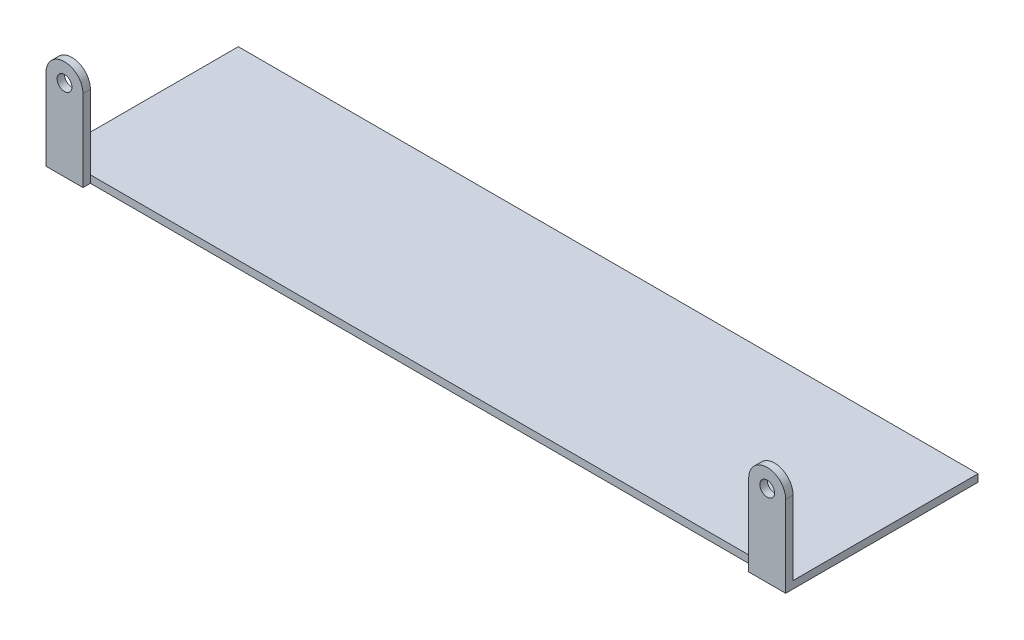
ISO-10303-21;
HEADER;
FILE_DESCRIPTION(('STEP AP214'),'2;1');
FILE_NAME('part.step','',(''),(''),'','','');
FILE_SCHEMA(('AUTOMOTIVE_DESIGN { 1 0 10303 214 1 1 1 1 }'));
ENDSEC;
DATA;
#1=APPLICATION_CONTEXT('core data for automotive mechanical design processes');
#2=APPLICATION_PROTOCOL_DEFINITION('international standard','automotive_design',2000,#1);
#3=PRODUCT_CONTEXT('',#1,'mechanical');
#4=PRODUCT('Part','Part','',(#3));
#5=PRODUCT_RELATED_PRODUCT_CATEGORY('part','',(#4));
#6=PRODUCT_DEFINITION_FORMATION('','',#4);
#7=PRODUCT_DEFINITION_CONTEXT('part definition',#1,'design');
#8=PRODUCT_DEFINITION('design','',#6,#7);
#9=PRODUCT_DEFINITION_SHAPE('','',#8);
#10=(LENGTH_UNIT() NAMED_UNIT(*) SI_UNIT(.MILLI.,.METRE.));
#11=(NAMED_UNIT(*) PLANE_ANGLE_UNIT() SI_UNIT($,.RADIAN.));
#12=(NAMED_UNIT(*) SI_UNIT($,.STERADIAN.) SOLID_ANGLE_UNIT());
#13=UNCERTAINTY_MEASURE_WITH_UNIT(LENGTH_MEASURE(1.E-05),#10,'distance_accuracy_value','');
#14=(GEOMETRIC_REPRESENTATION_CONTEXT(3) GLOBAL_UNCERTAINTY_ASSIGNED_CONTEXT((#13)) GLOBAL_UNIT_ASSIGNED_CONTEXT((#10,
#11,#12)) REPRESENTATION_CONTEXT('',''));
#15=CARTESIAN_POINT('',(0.,0.,0.));
#16=DIRECTION('',(0.,0.,1.));
#17=DIRECTION('',(1.,0.,0.));
#18=AXIS2_PLACEMENT_3D('',#15,#16,#17);
#19=CARTESIAN_POINT('',(100.,1.,25.));
#20=DIRECTION('',(0.,0.,-1.));
#21=DIRECTION('',(-1.,0.,0.));
#22=AXIS2_PLACEMENT_3D('',#19,#20,#21);
#23=PLANE('',#22);
#24=DIRECTION('',(0.,1.,0.));
#25=VECTOR('',#24,1.);
#26=CARTESIAN_POINT('',(-90.0000000000001,-1.,25.));
#27=LINE('',#26,#25);
#28=CARTESIAN_POINT('',(-90.0000000000001,-1.,25.));
#29=VERTEX_POINT('',#28);
#30=CARTESIAN_POINT('',(-90.0000000000001,1.,25.));
#31=VERTEX_POINT('',#30);
#32=EDGE_CURVE('E138',#29,#31,#27,.T.);
#33=ORIENTED_EDGE('',*,*,#32,.F.);
#34=DIRECTION('',(1.,0.,0.));
#35=VECTOR('',#34,1.);
#36=CARTESIAN_POINT('',(100.,-1.,25.));
#37=LINE('',#36,#35);
#38=CARTESIAN_POINT('',(90.0000000000001,-1.,25.));
#39=VERTEX_POINT('',#38);
#40=EDGE_CURVE('E192',#29,#39,#37,.T.);
#41=ORIENTED_EDGE('',*,*,#40,.T.);
#42=DIRECTION('',(0.,-1.,0.));
#43=VECTOR('',#42,1.);
#44=CARTESIAN_POINT('',(90.0000000000001,-1.,25.));
#45=LINE('',#44,#43);
#46=CARTESIAN_POINT('',(90.0000000000001,1.,25.));
#47=VERTEX_POINT('',#46);
#48=EDGE_CURVE('E11',#47,#39,#45,.T.);
#49=ORIENTED_EDGE('',*,*,#48,.F.);
#50=DIRECTION('',(1.,0.,0.));
#51=VECTOR('',#50,1.);
#52=CARTESIAN_POINT('',(100.,1.,25.));
#53=LINE('',#52,#51);
#54=EDGE_CURVE('E50',#31,#47,#53,.T.);
#55=ORIENTED_EDGE('',*,*,#54,.F.);
#56=EDGE_LOOP('',(#33,#41,#49,#55));
#57=FACE_BOUND('',#56,.T.);
#58=ADVANCED_FACE('F33',(#57),#23,.F.);
#59=CARTESIAN_POINT('',(-100.,1.,25.));
#60=DIRECTION('',(1.,0.,0.));
#61=DIRECTION('',(0.,0.,-1.));
#62=AXIS2_PLACEMENT_3D('',#59,#60,#61);
#63=PLANE('',#62);
#64=DIRECTION('',(0.,0.,1.));
#65=VECTOR('',#64,1.);
#66=CARTESIAN_POINT('',(-100.,-1.,25.));
#67=LINE('',#66,#65);
#68=CARTESIAN_POINT('',(-100.,-1.,-25.));
#69=VERTEX_POINT('',#68);
#70=CARTESIAN_POINT('',(-100.,-1.,27.));
#71=VERTEX_POINT('',#70);
#72=EDGE_CURVE('E124',#69,#71,#67,.T.);
#73=ORIENTED_EDGE('',*,*,#72,.T.);
#74=DIRECTION('',(0.,-1.,0.));
#75=VECTOR('',#74,1.);
#76=CARTESIAN_POINT('',(-100.,-1.,27.));
#77=LINE('',#76,#75);
#78=CARTESIAN_POINT('',(-100.,21.,27.));
#79=VERTEX_POINT('',#78);
#80=EDGE_CURVE('E116',#79,#71,#77,.T.);
#81=ORIENTED_EDGE('',*,*,#80,.F.);
#82=DIRECTION('',(0.,0.,-1.));
#83=VECTOR('',#82,1.);
#84=CARTESIAN_POINT('',(-100.,21.,27.));
#85=LINE('',#84,#83);
#86=CARTESIAN_POINT('',(-100.,21.,25.));
#87=VERTEX_POINT('',#86);
#88=EDGE_CURVE('E120',#79,#87,#85,.T.);
#89=ORIENTED_EDGE('',*,*,#88,.T.);
#90=DIRECTION('',(0.,-1.,0.));
#91=VECTOR('',#90,1.);
#92=CARTESIAN_POINT('',(-100.,-1.,25.));
#93=LINE('',#92,#91);
#94=CARTESIAN_POINT('',(-100.,1.,25.));
#95=VERTEX_POINT('',#94);
#96=EDGE_CURVE('E214',#87,#95,#93,.T.);
#97=ORIENTED_EDGE('',*,*,#96,.T.);
#98=DIRECTION('',(0.,0.,1.));
#99=VECTOR('',#98,1.);
#100=CARTESIAN_POINT('',(-100.,1.,25.));
#101=LINE('',#100,#99);
#102=CARTESIAN_POINT('',(-100.,1.,-25.));
#103=VERTEX_POINT('',#102);
#104=EDGE_CURVE('E180',#103,#95,#101,.T.);
#105=ORIENTED_EDGE('',*,*,#104,.F.);
#106=DIRECTION('',(0.,-1.,0.));
#107=VECTOR('',#106,1.);
#108=CARTESIAN_POINT('',(-100.,1.,-25.));
#109=LINE('',#108,#107);
#110=EDGE_CURVE('E190',#103,#69,#109,.T.);
#111=ORIENTED_EDGE('',*,*,#110,.T.);
#112=EDGE_LOOP('',(#73,#81,#89,#97,#105,#111));
#113=FACE_BOUND('',#112,.T.);
#114=ADVANCED_FACE('F35',(#113),#63,.F.);
#115=CARTESIAN_POINT('',(100.,1.,25.));
#116=DIRECTION('',(-1.,0.,0.));
#117=DIRECTION('',(0.,0.,1.));
#118=AXIS2_PLACEMENT_3D('',#115,#116,#117);
#119=PLANE('',#118);
#120=DIRECTION('',(0.,0.,-1.));
#121=VECTOR('',#120,1.);
#122=CARTESIAN_POINT('',(100.,-1.,25.));
#123=LINE('',#122,#121);
#124=CARTESIAN_POINT('',(100.,-1.,27.));
#125=VERTEX_POINT('',#124);
#126=CARTESIAN_POINT('',(100.,-1.,-25.));
#127=VERTEX_POINT('',#126);
#128=EDGE_CURVE('E194',#125,#127,#123,.T.);
#129=ORIENTED_EDGE('',*,*,#128,.T.);
#130=DIRECTION('',(0.,-1.,0.));
#131=VECTOR('',#130,1.);
#132=CARTESIAN_POINT('',(100.,1.,-25.));
#133=LINE('',#132,#131);
#134=CARTESIAN_POINT('',(100.,1.,-25.));
#135=VERTEX_POINT('',#134);
#136=EDGE_CURVE('E37',#135,#127,#133,.T.);
#137=ORIENTED_EDGE('',*,*,#136,.F.);
#138=DIRECTION('',(0.,0.,-1.));
#139=VECTOR('',#138,1.);
#140=CARTESIAN_POINT('',(100.,1.,25.));
#141=LINE('',#140,#139);
#142=CARTESIAN_POINT('',(100.,1.,25.));
#143=VERTEX_POINT('',#142);
#144=EDGE_CURVE('E186',#143,#135,#141,.T.);
#145=ORIENTED_EDGE('',*,*,#144,.F.);
#146=DIRECTION('',(0.,1.,0.));
#147=VECTOR('',#146,1.);
#148=CARTESIAN_POINT('',(100.,-1.,25.));
#149=LINE('',#148,#147);
#150=CARTESIAN_POINT('',(100.,21.,25.));
#151=VERTEX_POINT('',#150);
#152=EDGE_CURVE('E155',#143,#151,#149,.T.);
#153=ORIENTED_EDGE('',*,*,#152,.T.);
#154=DIRECTION('',(0.,0.,-1.));
#155=VECTOR('',#154,1.);
#156=CARTESIAN_POINT('',(100.,21.,27.));
#157=LINE('',#156,#155);
#158=CARTESIAN_POINT('',(100.,21.,27.));
#159=VERTEX_POINT('',#158);
#160=EDGE_CURVE('E177',#159,#151,#157,.T.);
#161=ORIENTED_EDGE('',*,*,#160,.F.);
#162=DIRECTION('',(0.,1.,0.));
#163=VECTOR('',#162,1.);
#164=CARTESIAN_POINT('',(100.,-1.,27.));
#165=LINE('',#164,#163);
#166=EDGE_CURVE('E157',#125,#159,#165,.T.);
#167=ORIENTED_EDGE('',*,*,#166,.F.);
#168=EDGE_LOOP('',(#129,#137,#145,#153,#161,#167));
#169=FACE_BOUND('',#168,.T.);
#170=ADVANCED_FACE('F228',(#169),#119,.F.);
#171=CARTESIAN_POINT('',(100.,1.,-25.));
#172=DIRECTION('',(0.,0.,1.));
#173=DIRECTION('',(1.,0.,0.));
#174=AXIS2_PLACEMENT_3D('',#171,#172,#173);
#175=PLANE('',#174);
#176=DIRECTION('',(-1.,0.,0.));
#177=VECTOR('',#176,1.);
#178=CARTESIAN_POINT('',(100.,-1.,-25.));
#179=LINE('',#178,#177);
#180=EDGE_CURVE('E183',#127,#69,#179,.T.);
#181=ORIENTED_EDGE('',*,*,#180,.T.);
#182=ORIENTED_EDGE('',*,*,#110,.F.);
#183=DIRECTION('',(-1.,0.,0.));
#184=VECTOR('',#183,1.);
#185=CARTESIAN_POINT('',(100.,1.,-25.));
#186=LINE('',#185,#184);
#187=EDGE_CURVE('E188',#135,#103,#186,.T.);
#188=ORIENTED_EDGE('',*,*,#187,.F.);
#189=ORIENTED_EDGE('',*,*,#136,.T.);
#190=EDGE_LOOP('',(#181,#182,#188,#189));
#191=FACE_BOUND('',#190,.T.);
#192=ADVANCED_FACE('F203',(#191),#175,.F.);
#193=CARTESIAN_POINT('',(0.,1.,0.));
#194=DIRECTION('',(0.,1.,0.));
#195=DIRECTION('',(0.,0.,1.));
#196=AXIS2_PLACEMENT_3D('',#193,#194,#195);
#197=PLANE('',#196);
#198=ORIENTED_EDGE('',*,*,#104,.T.);
#199=EDGE_CURVE('E184',#95,#31,#53,.T.);
#200=ORIENTED_EDGE('',*,*,#199,.T.);
#201=ORIENTED_EDGE('',*,*,#54,.T.);
#202=EDGE_CURVE('E182',#47,#143,#53,.T.);
#203=ORIENTED_EDGE('',*,*,#202,.T.);
#204=ORIENTED_EDGE('',*,*,#144,.T.);
#205=ORIENTED_EDGE('',*,*,#187,.T.);
#206=EDGE_LOOP('',(#198,#200,#201,#203,#204,#205));
#207=FACE_BOUND('',#206,.T.);
#208=ADVANCED_FACE('F225',(#207),#197,.T.);
#209=CARTESIAN_POINT('',(0.,-1.,0.));
#210=DIRECTION('',(0.,1.,0.));
#211=DIRECTION('',(0.,0.,1.));
#212=AXIS2_PLACEMENT_3D('',#209,#210,#211);
#213=PLANE('',#212);
#214=ORIENTED_EDGE('',*,*,#72,.F.);
#215=ORIENTED_EDGE('',*,*,#180,.F.);
#216=ORIENTED_EDGE('',*,*,#128,.F.);
#217=DIRECTION('',(1.,0.,0.));
#218=VECTOR('',#217,1.);
#219=CARTESIAN_POINT('',(100.,-1.,27.));
#220=LINE('',#219,#218);
#221=CARTESIAN_POINT('',(90.0000000000001,-1.,27.));
#222=VERTEX_POINT('',#221);
#223=EDGE_CURVE('E164',#222,#125,#220,.T.);
#224=ORIENTED_EDGE('',*,*,#223,.F.);
#225=DIRECTION('',(0.,0.,-1.));
#226=VECTOR('',#225,1.);
#227=CARTESIAN_POINT('',(90.0000000000001,-1.,27.));
#228=LINE('',#227,#226);
#229=EDGE_CURVE('E167',#222,#39,#228,.T.);
#230=ORIENTED_EDGE('',*,*,#229,.T.);
#231=ORIENTED_EDGE('',*,*,#40,.F.);
#232=DIRECTION('',(0.,0.,-1.));
#233=VECTOR('',#232,1.);
#234=CARTESIAN_POINT('',(-90.0000000000001,-1.,27.));
#235=LINE('',#234,#233);
#236=CARTESIAN_POINT('',(-90.0000000000001,-1.,27.));
#237=VERTEX_POINT('',#236);
#238=EDGE_CURVE('E144',#237,#29,#235,.T.);
#239=ORIENTED_EDGE('',*,*,#238,.F.);
#240=DIRECTION('',(1.,0.,0.));
#241=VECTOR('',#240,1.);
#242=CARTESIAN_POINT('',(-100.,-1.,27.));
#243=LINE('',#242,#241);
#244=EDGE_CURVE('E127',#71,#237,#243,.T.);
#245=ORIENTED_EDGE('',*,*,#244,.F.);
#246=EDGE_LOOP('',(#214,#215,#216,#224,#230,#231,#239,#245));
#247=FACE_BOUND('',#246,.T.);
#248=ADVANCED_FACE('F207',(#247),#213,.F.);
#249=CARTESIAN_POINT('',(95.0000000000001,21.,25.));
#250=DIRECTION('',(0.,0.,-1.));
#251=DIRECTION('',(-1.,0.,0.));
#252=AXIS2_PLACEMENT_3D('',#249,#250,#251);
#253=PLANE('',#252);
#254=CARTESIAN_POINT('',(95.0000000000001,21.,25.));
#255=DIRECTION('',(0.,0.,1.));
#256=DIRECTION('',(1.,0.,0.));
#257=AXIS2_PLACEMENT_3D('',#254,#255,#256);
#258=CIRCLE('',#257,2.);
#259=CARTESIAN_POINT('',(97.0000000000001,21.,25.));
#260=VERTEX_POINT('',#259);
#261=EDGE_CURVE('E143',#260,#260,#258,.T.);
#262=ORIENTED_EDGE('',*,*,#261,.T.);
#263=EDGE_LOOP('',(#262));
#264=FACE_BOUND('',#263,.T.);
#265=ORIENTED_EDGE('',*,*,#202,.F.);
#266=CARTESIAN_POINT('',(90.0000000000001,21.,25.));
#267=VERTEX_POINT('',#266);
#268=EDGE_CURVE('E43',#267,#47,#45,.T.);
#269=ORIENTED_EDGE('',*,*,#268,.F.);
#270=CARTESIAN_POINT('',(95.0000000000001,21.,25.));
#271=DIRECTION('',(0.,0.,1.));
#272=DIRECTION('',(-1.,0.,0.));
#273=AXIS2_PLACEMENT_3D('',#270,#271,#272);
#274=CIRCLE('',#273,5.);
#275=EDGE_CURVE('E169',#151,#267,#274,.T.);
#276=ORIENTED_EDGE('',*,*,#275,.F.);
#277=ORIENTED_EDGE('',*,*,#152,.F.);
#278=EDGE_LOOP('',(#265,#269,#276,#277));
#279=FACE_BOUND('',#278,.T.);
#280=ADVANCED_FACE('F232',(#264,#279),#253,.T.);
#281=CARTESIAN_POINT('',(95.0000000000001,21.,27.));
#282=DIRECTION('',(0.,0.,-1.));
#283=DIRECTION('',(-1.,0.,0.));
#284=AXIS2_PLACEMENT_3D('',#281,#282,#283);
#285=PLANE('',#284);
#286=ORIENTED_EDGE('',*,*,#166,.T.);
#287=CARTESIAN_POINT('',(95.0000000000001,21.,27.));
#288=DIRECTION('',(0.,0.,1.));
#289=DIRECTION('',(-1.,0.,0.));
#290=AXIS2_PLACEMENT_3D('',#287,#288,#289);
#291=CIRCLE('',#290,5.);
#292=CARTESIAN_POINT('',(90.0000000000001,21.,27.));
#293=VERTEX_POINT('',#292);
#294=EDGE_CURVE('E160',#159,#293,#291,.T.);
#295=ORIENTED_EDGE('',*,*,#294,.T.);
#296=DIRECTION('',(0.,-1.,0.));
#297=VECTOR('',#296,1.);
#298=CARTESIAN_POINT('',(90.0000000000001,-1.,27.));
#299=LINE('',#298,#297);
#300=EDGE_CURVE('E162',#293,#222,#299,.T.);
#301=ORIENTED_EDGE('',*,*,#300,.T.);
#302=ORIENTED_EDGE('',*,*,#223,.T.);
#303=EDGE_LOOP('',(#286,#295,#301,#302));
#304=FACE_BOUND('',#303,.T.);
#305=CARTESIAN_POINT('',(95.0000000000001,21.,27.));
#306=DIRECTION('',(0.,0.,1.));
#307=DIRECTION('',(1.,0.,0.));
#308=AXIS2_PLACEMENT_3D('',#305,#306,#307);
#309=CIRCLE('',#308,2.);
#310=CARTESIAN_POINT('',(97.0000000000001,21.,27.));
#311=VERTEX_POINT('',#310);
#312=EDGE_CURVE('E147',#311,#311,#309,.T.);
#313=ORIENTED_EDGE('',*,*,#312,.F.);
#314=EDGE_LOOP('',(#313));
#315=FACE_BOUND('',#314,.T.);
#316=ADVANCED_FACE('F239',(#304,#315),#285,.F.);
#317=CARTESIAN_POINT('',(95.0000000000001,21.,27.));
#318=DIRECTION('',(0.,0.,-1.));
#319=DIRECTION('',(-1.,0.,0.));
#320=AXIS2_PLACEMENT_3D('',#317,#318,#319);
#321=CYLINDRICAL_SURFACE('',#320,5.);
#322=ORIENTED_EDGE('',*,*,#275,.T.);
#323=DIRECTION('',(0.,0.,-1.));
#324=VECTOR('',#323,1.);
#325=CARTESIAN_POINT('',(90.0000000000001,21.,27.));
#326=LINE('',#325,#324);
#327=EDGE_CURVE('E174',#293,#267,#326,.T.);
#328=ORIENTED_EDGE('',*,*,#327,.F.);
#329=ORIENTED_EDGE('',*,*,#294,.F.);
#330=ORIENTED_EDGE('',*,*,#160,.T.);
#331=EDGE_LOOP('',(#322,#328,#329,#330));
#332=FACE_BOUND('',#331,.T.);
#333=ADVANCED_FACE('F236',(#332),#321,.T.);
#334=CARTESIAN_POINT('',(90.0000000000001,-1.,27.));
#335=DIRECTION('',(1.,0.,0.));
#336=DIRECTION('',(0.,0.,-1.));
#337=AXIS2_PLACEMENT_3D('',#334,#335,#336);
#338=PLANE('',#337);
#339=ORIENTED_EDGE('',*,*,#268,.T.);
#340=ORIENTED_EDGE('',*,*,#48,.T.);
#341=ORIENTED_EDGE('',*,*,#229,.F.);
#342=ORIENTED_EDGE('',*,*,#300,.F.);
#343=ORIENTED_EDGE('',*,*,#327,.T.);
#344=EDGE_LOOP('',(#339,#340,#341,#342,#343));
#345=FACE_BOUND('',#344,.T.);
#346=ADVANCED_FACE('F244',(#345),#338,.F.);
#347=CARTESIAN_POINT('',(95.0000000000001,21.,27.));
#348=DIRECTION('',(0.,0.,-1.));
#349=DIRECTION('',(-1.,0.,0.));
#350=AXIS2_PLACEMENT_3D('',#347,#348,#349);
#351=CYLINDRICAL_SURFACE('',#350,2.);
#352=ORIENTED_EDGE('',*,*,#312,.T.);
#353=EDGE_LOOP('',(#352));
#354=FACE_BOUND('',#353,.T.);
#355=ORIENTED_EDGE('',*,*,#261,.F.);
#356=EDGE_LOOP('',(#355));
#357=FACE_BOUND('',#356,.T.);
#358=ADVANCED_FACE('F274',(#354,#357),#351,.F.);
#359=CARTESIAN_POINT('',(-95.0000000000001,21.,27.));
#360=DIRECTION('',(0.,0.,1.));
#361=DIRECTION('',(1.,0.,0.));
#362=AXIS2_PLACEMENT_3D('',#359,#360,#361);
#363=PLANE('',#362);
#364=CARTESIAN_POINT('',(-95.0000000000001,21.,27.));
#365=DIRECTION('',(0.,0.,1.));
#366=DIRECTION('',(1.,0.,0.));
#367=AXIS2_PLACEMENT_3D('',#364,#365,#366);
#368=CIRCLE('',#367,5.);
#369=CARTESIAN_POINT('',(-90.0000000000001,21.,27.));
#370=VERTEX_POINT('',#369);
#371=EDGE_CURVE('E128',#370,#79,#368,.T.);
#372=ORIENTED_EDGE('',*,*,#371,.T.);
#373=ORIENTED_EDGE('',*,*,#80,.T.);
#374=ORIENTED_EDGE('',*,*,#244,.T.);
#375=DIRECTION('',(0.,1.,0.));
#376=VECTOR('',#375,1.);
#377=CARTESIAN_POINT('',(-90.0000000000001,-1.,27.));
#378=LINE('',#377,#376);
#379=EDGE_CURVE('E134',#237,#370,#378,.T.);
#380=ORIENTED_EDGE('',*,*,#379,.T.);
#381=EDGE_LOOP('',(#372,#373,#374,#380));
#382=FACE_BOUND('',#381,.T.);
#383=CARTESIAN_POINT('',(-95.0000000000001,21.,27.));
#384=DIRECTION('',(0.,0.,1.));
#385=DIRECTION('',(-1.,0.,0.));
#386=AXIS2_PLACEMENT_3D('',#383,#384,#385);
#387=CIRCLE('',#386,2.);
#388=CARTESIAN_POINT('',(-97.0000000000001,21.,27.));
#389=VERTEX_POINT('',#388);
#390=EDGE_CURVE('E215',#389,#389,#387,.T.);
#391=ORIENTED_EDGE('',*,*,#390,.F.);
#392=EDGE_LOOP('',(#391));
#393=FACE_BOUND('',#392,.T.);
#394=ADVANCED_FACE('F131',(#382,#393),#363,.T.);
#395=CARTESIAN_POINT('',(-95.0000000000001,21.,25.));
#396=DIRECTION('',(0.,0.,1.));
#397=DIRECTION('',(1.,0.,0.));
#398=AXIS2_PLACEMENT_3D('',#395,#396,#397);
#399=PLANE('',#398);
#400=ORIENTED_EDGE('',*,*,#199,.F.);
#401=ORIENTED_EDGE('',*,*,#96,.F.);
#402=CARTESIAN_POINT('',(-95.0000000000001,21.,25.));
#403=DIRECTION('',(0.,0.,1.));
#404=DIRECTION('',(1.,0.,0.));
#405=AXIS2_PLACEMENT_3D('',#402,#403,#404);
#406=CIRCLE('',#405,5.);
#407=CARTESIAN_POINT('',(-90.0000000000001,21.,25.));
#408=VERTEX_POINT('',#407);
#409=EDGE_CURVE('E142',#408,#87,#406,.T.);
#410=ORIENTED_EDGE('',*,*,#409,.F.);
#411=EDGE_CURVE('E217',#31,#408,#27,.T.);
#412=ORIENTED_EDGE('',*,*,#411,.F.);
#413=EDGE_LOOP('',(#400,#401,#410,#412));
#414=FACE_BOUND('',#413,.T.);
#415=CARTESIAN_POINT('',(-95.0000000000001,21.,25.));
#416=DIRECTION('',(0.,0.,1.));
#417=DIRECTION('',(-1.,0.,0.));
#418=AXIS2_PLACEMENT_3D('',#415,#416,#417);
#419=CIRCLE('',#418,2.);
#420=CARTESIAN_POINT('',(-97.0000000000001,21.,25.));
#421=VERTEX_POINT('',#420);
#422=EDGE_CURVE('E397',#421,#421,#419,.T.);
#423=ORIENTED_EDGE('',*,*,#422,.T.);
#424=EDGE_LOOP('',(#423));
#425=FACE_BOUND('',#424,.T.);
#426=ADVANCED_FACE('F223',(#414,#425),#399,.F.);
#427=CARTESIAN_POINT('',(-95.0000000000001,21.,27.));
#428=DIRECTION('',(0.,0.,-1.));
#429=DIRECTION('',(-1.,0.,0.));
#430=AXIS2_PLACEMENT_3D('',#427,#428,#429);
#431=CYLINDRICAL_SURFACE('',#430,5.);
#432=ORIENTED_EDGE('',*,*,#409,.T.);
#433=ORIENTED_EDGE('',*,*,#88,.F.);
#434=ORIENTED_EDGE('',*,*,#371,.F.);
#435=DIRECTION('',(0.,0.,-1.));
#436=VECTOR('',#435,1.);
#437=CARTESIAN_POINT('',(-90.0000000000001,21.,27.));
#438=LINE('',#437,#436);
#439=EDGE_CURVE('E150',#370,#408,#438,.T.);
#440=ORIENTED_EDGE('',*,*,#439,.T.);
#441=EDGE_LOOP('',(#432,#433,#434,#440));
#442=FACE_BOUND('',#441,.T.);
#443=ADVANCED_FACE('F140',(#442),#431,.T.);
#444=CARTESIAN_POINT('',(-90.0000000000001,-1.,27.));
#445=DIRECTION('',(-1.,0.,0.));
#446=DIRECTION('',(0.,0.,1.));
#447=AXIS2_PLACEMENT_3D('',#444,#445,#446);
#448=PLANE('',#447);
#449=ORIENTED_EDGE('',*,*,#32,.T.);
#450=ORIENTED_EDGE('',*,*,#411,.T.);
#451=ORIENTED_EDGE('',*,*,#439,.F.);
#452=ORIENTED_EDGE('',*,*,#379,.F.);
#453=ORIENTED_EDGE('',*,*,#238,.T.);
#454=EDGE_LOOP('',(#449,#450,#451,#452,#453));
#455=FACE_BOUND('',#454,.T.);
#456=ADVANCED_FACE('F245',(#455),#448,.F.);
#457=CARTESIAN_POINT('',(-95.0000000000001,21.,27.));
#458=DIRECTION('',(0.,0.,-1.));
#459=DIRECTION('',(-1.,0.,0.));
#460=AXIS2_PLACEMENT_3D('',#457,#458,#459);
#461=CYLINDRICAL_SURFACE('',#460,2.);
#462=ORIENTED_EDGE('',*,*,#390,.T.);
#463=EDGE_LOOP('',(#462));
#464=FACE_BOUND('',#463,.T.);
#465=ORIENTED_EDGE('',*,*,#422,.F.);
#466=EDGE_LOOP('',(#465));
#467=FACE_BOUND('',#466,.T.);
#468=ADVANCED_FACE('F247',(#464,#467),#461,.F.);
#469=CLOSED_SHELL('',(#58,#114,#170,#192,#208,#248,#280,#316,#333,#346,#358,#394,#426,#443,#456,#468));
#470=MANIFOLD_SOLID_BREP('B2',#469);
#471=ADVANCED_BREP_SHAPE_REPRESENTATION('',(#18,#470),#14);
#472=SHAPE_DEFINITION_REPRESENTATION(#9,#471);
ENDSEC;
END-ISO-10303-21;
